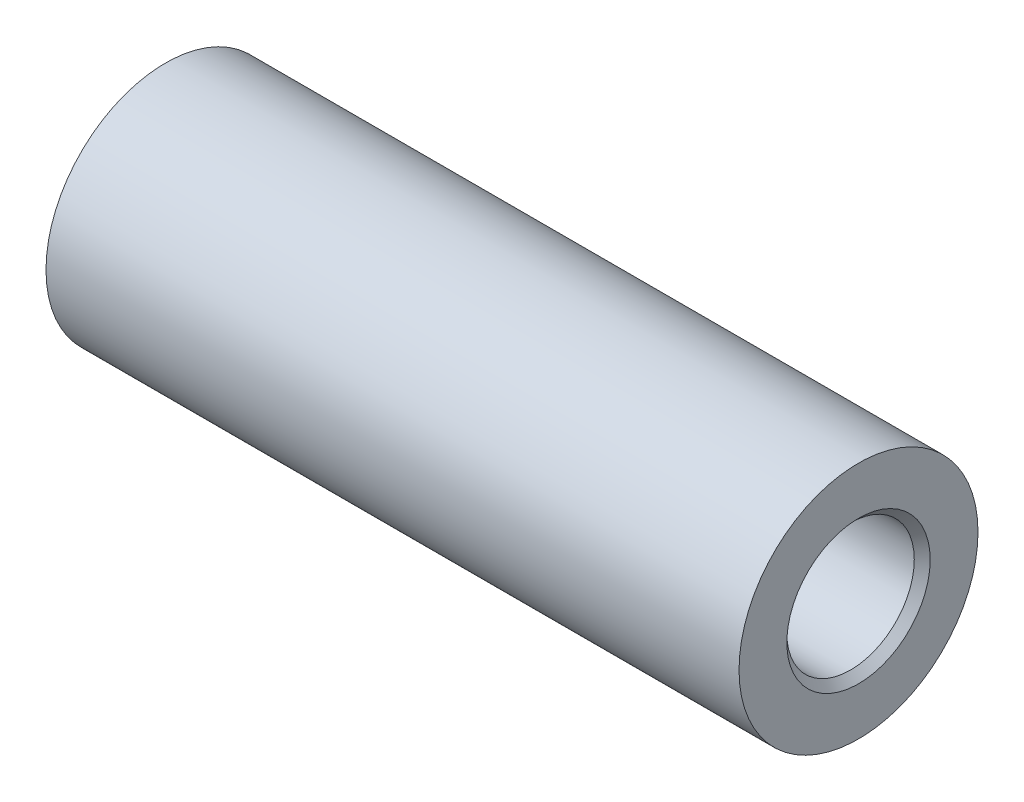
ISO-10303-21;
HEADER;
FILE_DESCRIPTION(('STEP AP214'),'2;1');
FILE_NAME('part.step','',(''),(''),'','','');
FILE_SCHEMA(('AUTOMOTIVE_DESIGN { 1 0 10303 214 1 1 1 1 }'));
ENDSEC;
DATA;
#1=APPLICATION_CONTEXT('core data for automotive mechanical design processes');
#2=APPLICATION_PROTOCOL_DEFINITION('international standard','automotive_design',2000,#1);
#3=PRODUCT_CONTEXT('',#1,'mechanical');
#4=PRODUCT('Part','Part','',(#3));
#5=PRODUCT_RELATED_PRODUCT_CATEGORY('part','',(#4));
#6=PRODUCT_DEFINITION_FORMATION('','',#4);
#7=PRODUCT_DEFINITION_CONTEXT('part definition',#1,'design');
#8=PRODUCT_DEFINITION('design','',#6,#7);
#9=PRODUCT_DEFINITION_SHAPE('','',#8);
#10=(LENGTH_UNIT() NAMED_UNIT(*) SI_UNIT(.MILLI.,.METRE.));
#11=(NAMED_UNIT(*) PLANE_ANGLE_UNIT() SI_UNIT($,.RADIAN.));
#12=(NAMED_UNIT(*) SI_UNIT($,.STERADIAN.) SOLID_ANGLE_UNIT());
#13=UNCERTAINTY_MEASURE_WITH_UNIT(LENGTH_MEASURE(1.E-05),#10,'distance_accuracy_value','');
#14=(GEOMETRIC_REPRESENTATION_CONTEXT(3) GLOBAL_UNCERTAINTY_ASSIGNED_CONTEXT((#13)) GLOBAL_UNIT_ASSIGNED_CONTEXT((#10,
#11,#12)) REPRESENTATION_CONTEXT('',''));
#15=CARTESIAN_POINT('',(0.,0.,0.));
#16=DIRECTION('',(0.,0.,1.));
#17=DIRECTION('',(1.,0.,0.));
#18=AXIS2_PLACEMENT_3D('',#15,#16,#17);
#19=CARTESIAN_POINT('',(-1.95871896588202,0.,0.));
#20=DIRECTION('',(1.,0.,0.));
#21=DIRECTION('',(0.,0.,-1.));
#22=AXIS2_PLACEMENT_3D('',#19,#20,#21);
#23=CYLINDRICAL_SURFACE('',#22,1.6);
#24=CARTESIAN_POINT('',(0.200000000006639,0.,0.));
#25=DIRECTION('',(-1.,0.,0.));
#26=DIRECTION('',(0.,0.,-1.));
#27=AXIS2_PLACEMENT_3D('',#24,#25,#26);
#28=CIRCLE('',#27,1.59999999999627);
#29=CARTESIAN_POINT('',(0.200000000006639,0.,-1.59999999999627));
#30=VERTEX_POINT('',#29);
#31=EDGE_CURVE('E36',#30,#30,#28,.T.);
#32=ORIENTED_EDGE('',*,*,#31,.T.);
#33=EDGE_LOOP('',(#32));
#34=FACE_BOUND('',#33,.T.);
#35=CARTESIAN_POINT('',(17.1999999999457,0.,0.));
#36=DIRECTION('',(1.,0.,0.));
#37=DIRECTION('',(0.,0.,1.));
#38=AXIS2_PLACEMENT_3D('',#35,#36,#37);
#39=CIRCLE('',#38,1.59999999999627);
#40=CARTESIAN_POINT('',(17.1999999999457,0.,1.59999999999627));
#41=VERTEX_POINT('',#40);
#42=EDGE_CURVE('E40',#41,#41,#39,.T.);
#43=ORIENTED_EDGE('',*,*,#42,.T.);
#44=EDGE_LOOP('',(#43));
#45=FACE_BOUND('',#44,.T.);
#46=ADVANCED_FACE('F15',(#34,#45),#23,.F.);
#47=CARTESIAN_POINT('',(17.3999999998955,0.,0.));
#48=DIRECTION('',(1.,0.,0.));
#49=DIRECTION('',(0.,0.,-1.));
#50=AXIS2_PLACEMENT_3D('',#47,#48,#49);
#51=CONICAL_SURFACE('',#50,1.79999999994607,0.785398163539557);
#52=CARTESIAN_POINT('',(17.3999999999523,0.,0.));
#53=DIRECTION('',(1.,0.,0.));
#54=DIRECTION('',(0.,0.,-1.));
#55=AXIS2_PLACEMENT_3D('',#52,#53,#54);
#56=CIRCLE('',#55,1.80000000000291);
#57=CARTESIAN_POINT('',(17.3999999999523,0.,-1.80000000000291));
#58=VERTEX_POINT('',#57);
#59=EDGE_CURVE('E18',#58,#58,#56,.F.);
#60=ORIENTED_EDGE('',*,*,#59,.F.);
#61=EDGE_LOOP('',(#60));
#62=FACE_BOUND('',#61,.T.);
#63=ORIENTED_EDGE('',*,*,#42,.F.);
#64=EDGE_LOOP('',(#63));
#65=FACE_BOUND('',#64,.T.);
#66=ADVANCED_FACE('F50',(#62,#65),#51,.F.);
#67=CARTESIAN_POINT('',(5.6843418860808E-11,0.,0.));
#68=DIRECTION('',(-1.,0.,0.));
#69=DIRECTION('',(0.,0.,1.));
#70=AXIS2_PLACEMENT_3D('',#67,#68,#69);
#71=CONICAL_SURFACE('',#70,1.79999999994607,0.785398163397448);
#72=CARTESIAN_POINT('',(5.6843418860808E-11,0.,0.));
#73=DIRECTION('',(-1.,0.,0.));
#74=DIRECTION('',(0.,0.,1.));
#75=AXIS2_PLACEMENT_3D('',#72,#73,#74);
#76=CIRCLE('',#75,1.79999999994607);
#77=CARTESIAN_POINT('',(5.6843418860808E-11,0.,1.79999999994607));
#78=VERTEX_POINT('',#77);
#79=EDGE_CURVE('E27',#78,#78,#76,.T.);
#80=ORIENTED_EDGE('',*,*,#79,.T.);
#81=EDGE_LOOP('',(#80));
#82=FACE_BOUND('',#81,.T.);
#83=ORIENTED_EDGE('',*,*,#31,.F.);
#84=EDGE_LOOP('',(#83));
#85=FACE_BOUND('',#84,.T.);
#86=ADVANCED_FACE('F52',(#82,#85),#71,.F.);
#87=CARTESIAN_POINT('',(17.4,0.,0.));
#88=DIRECTION('',(1.,0.,0.));
#89=DIRECTION('',(0.,0.,-1.));
#90=AXIS2_PLACEMENT_3D('',#87,#88,#89);
#91=PLANE('',#90);
#92=ORIENTED_EDGE('',*,*,#59,.T.);
#93=EDGE_LOOP('',(#92));
#94=FACE_BOUND('',#93,.T.);
#95=CARTESIAN_POINT('',(17.4,0.,0.));
#96=DIRECTION('',(1.,0.,0.));
#97=DIRECTION('',(0.,0.,-1.));
#98=AXIS2_PLACEMENT_3D('',#95,#96,#97);
#99=CIRCLE('',#98,3.);
#100=CARTESIAN_POINT('',(17.4,0.,-3.));
#101=VERTEX_POINT('',#100);
#102=EDGE_CURVE('E22',#101,#101,#99,.F.);
#103=ORIENTED_EDGE('',*,*,#102,.F.);
#104=EDGE_LOOP('',(#103));
#105=FACE_BOUND('',#104,.T.);
#106=ADVANCED_FACE('F59',(#94,#105),#91,.T.);
#107=CARTESIAN_POINT('',(0.,0.,0.));
#108=DIRECTION('',(1.,0.,0.));
#109=DIRECTION('',(0.,0.,-1.));
#110=AXIS2_PLACEMENT_3D('',#107,#108,#109);
#111=PLANE('',#110);
#112=ORIENTED_EDGE('',*,*,#79,.F.);
#113=EDGE_LOOP('',(#112));
#114=FACE_BOUND('',#113,.T.);
#115=CARTESIAN_POINT('',(0.,0.,0.));
#116=DIRECTION('',(1.,0.,0.));
#117=DIRECTION('',(0.,0.,-1.));
#118=AXIS2_PLACEMENT_3D('',#115,#116,#117);
#119=CIRCLE('',#118,3.);
#120=CARTESIAN_POINT('',(0.,0.,-3.));
#121=VERTEX_POINT('',#120);
#122=EDGE_CURVE('E10',#121,#121,#119,.T.);
#123=ORIENTED_EDGE('',*,*,#122,.F.);
#124=EDGE_LOOP('',(#123));
#125=FACE_BOUND('',#124,.T.);
#126=ADVANCED_FACE('F63',(#114,#125),#111,.F.);
#127=CARTESIAN_POINT('',(0.,0.,0.));
#128=DIRECTION('',(1.,0.,0.));
#129=DIRECTION('',(0.,0.,-1.));
#130=AXIS2_PLACEMENT_3D('',#127,#128,#129);
#131=CYLINDRICAL_SURFACE('',#130,3.);
#132=ORIENTED_EDGE('',*,*,#122,.T.);
#133=EDGE_LOOP('',(#132));
#134=FACE_BOUND('',#133,.T.);
#135=ORIENTED_EDGE('',*,*,#102,.T.);
#136=EDGE_LOOP('',(#135));
#137=FACE_BOUND('',#136,.T.);
#138=ADVANCED_FACE('F61',(#134,#137),#131,.T.);
#139=CLOSED_SHELL('',(#46,#66,#86,#106,#126,#138));
#140=MANIFOLD_SOLID_BREP('B1',#139);
#141=ADVANCED_BREP_SHAPE_REPRESENTATION('',(#18,#140),#14);
#142=SHAPE_DEFINITION_REPRESENTATION(#9,#141);
ENDSEC;
END-ISO-10303-21;
